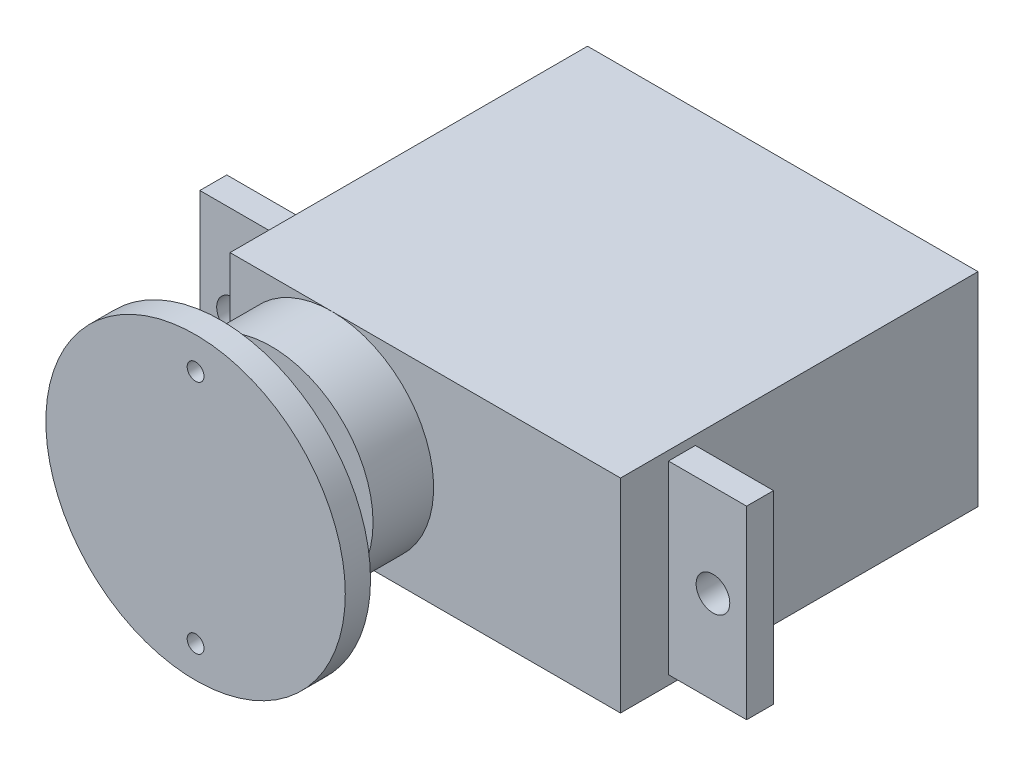
ISO-10303-21;
HEADER;
FILE_DESCRIPTION(('STEP AP214'),'2;1');
FILE_NAME('part.step','',(''),(''),'','','');
FILE_SCHEMA(('AUTOMOTIVE_DESIGN { 1 0 10303 214 1 1 1 1 }'));
ENDSEC;
DATA;
#1=APPLICATION_CONTEXT('core data for automotive mechanical design processes');
#2=APPLICATION_PROTOCOL_DEFINITION('international standard','automotive_design',2000,#1);
#3=PRODUCT_CONTEXT('',#1,'mechanical');
#4=PRODUCT('Part','Part','',(#3));
#5=PRODUCT_RELATED_PRODUCT_CATEGORY('part','',(#4));
#6=PRODUCT_DEFINITION_FORMATION('','',#4);
#7=PRODUCT_DEFINITION_CONTEXT('part definition',#1,'design');
#8=PRODUCT_DEFINITION('design','',#6,#7);
#9=PRODUCT_DEFINITION_SHAPE('','',#8);
#10=(LENGTH_UNIT() NAMED_UNIT(*) SI_UNIT(.MILLI.,.METRE.));
#11=(NAMED_UNIT(*) PLANE_ANGLE_UNIT() SI_UNIT($,.RADIAN.));
#12=(NAMED_UNIT(*) SI_UNIT($,.STERADIAN.) SOLID_ANGLE_UNIT());
#13=UNCERTAINTY_MEASURE_WITH_UNIT(LENGTH_MEASURE(1.E-05),#10,'distance_accuracy_value','');
#14=(GEOMETRIC_REPRESENTATION_CONTEXT(3) GLOBAL_UNCERTAINTY_ASSIGNED_CONTEXT((#13)) GLOBAL_UNIT_ASSIGNED_CONTEXT((#10,
#11,#12)) REPRESENTATION_CONTEXT('',''));
#15=CARTESIAN_POINT('',(0.,0.,0.));
#16=DIRECTION('',(0.,0.,1.));
#17=DIRECTION('',(1.,0.,0.));
#18=AXIS2_PLACEMENT_3D('',#15,#16,#17);
#19=CARTESIAN_POINT('',(23.21,0.,21.25));
#20=DIRECTION('',(-1.,0.,0.));
#21=DIRECTION('',(0.,0.,1.));
#22=AXIS2_PLACEMENT_3D('',#19,#20,#21);
#23=PLANE('',#22);
#24=DIRECTION('',(0.,1.,0.));
#25=VECTOR('',#24,1.);
#26=CARTESIAN_POINT('',(23.21,0.,0.));
#27=LINE('',#26,#25);
#28=CARTESIAN_POINT('',(23.21,0.,0.));
#29=VERTEX_POINT('',#28);
#30=CARTESIAN_POINT('',(23.21,12.1,0.));
#31=VERTEX_POINT('',#30);
#32=EDGE_CURVE('E271',#29,#31,#27,.T.);
#33=ORIENTED_EDGE('',*,*,#32,.T.);
#34=DIRECTION('',(0.,0.,-1.));
#35=VECTOR('',#34,1.);
#36=CARTESIAN_POINT('',(23.21,12.1,21.25));
#37=LINE('',#36,#35);
#38=CARTESIAN_POINT('',(23.21,12.1,21.25));
#39=VERTEX_POINT('',#38);
#40=EDGE_CURVE('E277',#39,#31,#37,.T.);
#41=ORIENTED_EDGE('',*,*,#40,.F.);
#42=DIRECTION('',(0.,1.,0.));
#43=VECTOR('',#42,1.);
#44=CARTESIAN_POINT('',(23.21,0.,21.25));
#45=LINE('',#44,#43);
#46=CARTESIAN_POINT('',(23.21,0.,21.25));
#47=VERTEX_POINT('',#46);
#48=EDGE_CURVE('E257',#47,#39,#45,.T.);
#49=ORIENTED_EDGE('',*,*,#48,.F.);
#50=DIRECTION('',(0.,0.,-1.));
#51=VECTOR('',#50,1.);
#52=CARTESIAN_POINT('',(23.21,0.,21.25));
#53=LINE('',#52,#51);
#54=EDGE_CURVE('E281',#47,#29,#53,.T.);
#55=ORIENTED_EDGE('',*,*,#54,.T.);
#56=EDGE_LOOP('',(#33,#41,#49,#55));
#57=FACE_BOUND('',#56,.T.);
#58=DIRECTION('',(0.,0.,-1.));
#59=VECTOR('',#58,1.);
#60=CARTESIAN_POINT('',(23.21,0.55,18.4));
#61=LINE('',#60,#59);
#62=CARTESIAN_POINT('',(23.21,0.55,18.4));
#63=VERTEX_POINT('',#62);
#64=CARTESIAN_POINT('',(23.21,0.55,16.8));
#65=VERTEX_POINT('',#64);
#66=EDGE_CURVE('E35',#63,#65,#61,.T.);
#67=ORIENTED_EDGE('',*,*,#66,.F.);
#68=DIRECTION('',(0.,-1.,0.));
#69=VECTOR('',#68,1.);
#70=CARTESIAN_POINT('',(23.21,11.55,18.4));
#71=LINE('',#70,#69);
#72=CARTESIAN_POINT('',(23.21,11.55,18.4));
#73=VERTEX_POINT('',#72);
#74=EDGE_CURVE('E39',#73,#63,#71,.T.);
#75=ORIENTED_EDGE('',*,*,#74,.F.);
#76=DIRECTION('',(0.,0.,1.));
#77=VECTOR('',#76,1.);
#78=CARTESIAN_POINT('',(23.21,11.55,16.8));
#79=LINE('',#78,#77);
#80=CARTESIAN_POINT('',(23.21,11.55,16.8));
#81=VERTEX_POINT('',#80);
#82=EDGE_CURVE('E147',#81,#73,#79,.T.);
#83=ORIENTED_EDGE('',*,*,#82,.F.);
#84=DIRECTION('',(0.,1.,0.));
#85=VECTOR('',#84,1.);
#86=CARTESIAN_POINT('',(23.21,0.55,16.8));
#87=LINE('',#86,#85);
#88=EDGE_CURVE('E157',#65,#81,#87,.T.);
#89=ORIENTED_EDGE('',*,*,#88,.F.);
#90=EDGE_LOOP('',(#67,#75,#83,#89));
#91=FACE_BOUND('',#90,.T.);
#92=ADVANCED_FACE('F17',(#57,#91),#23,.F.);
#93=CARTESIAN_POINT('',(0.,0.,21.25));
#94=DIRECTION('',(0.,0.,1.));
#95=DIRECTION('',(1.,0.,0.));
#96=AXIS2_PLACEMENT_3D('',#93,#94,#95);
#97=PLANE('',#96);
#98=CARTESIAN_POINT('',(6.05,6.05,21.25));
#99=DIRECTION('',(0.,0.,1.));
#100=DIRECTION('',(1.,0.,0.));
#101=AXIS2_PLACEMENT_3D('',#98,#99,#100);
#102=CIRCLE('',#101,6.05);
#103=CARTESIAN_POINT('',(6.05,12.1,21.25));
#104=VERTEX_POINT('',#103);
#105=CARTESIAN_POINT('',(0.,6.05,21.25));
#106=VERTEX_POINT('',#105);
#107=EDGE_CURVE('E191',#104,#106,#102,.T.);
#108=ORIENTED_EDGE('',*,*,#107,.F.);
#109=DIRECTION('',(-1.,0.,0.));
#110=VECTOR('',#109,1.);
#111=CARTESIAN_POINT('',(23.21,12.1,21.25));
#112=LINE('',#111,#110);
#113=CARTESIAN_POINT('',(0.,12.1,21.25));
#114=VERTEX_POINT('',#113);
#115=EDGE_CURVE('E260',#104,#114,#112,.T.);
#116=ORIENTED_EDGE('',*,*,#115,.T.);
#117=DIRECTION('',(0.,-1.,0.));
#118=VECTOR('',#117,1.);
#119=CARTESIAN_POINT('',(0.,12.1,21.25));
#120=LINE('',#119,#118);
#121=EDGE_CURVE('E247',#114,#106,#120,.T.);
#122=ORIENTED_EDGE('',*,*,#121,.T.);
#123=EDGE_LOOP('',(#108,#116,#122));
#124=FACE_BOUND('',#123,.T.);
#125=ADVANCED_FACE('F338',(#124),#97,.T.);
#126=CARTESIAN_POINT('',(6.05,0.,21.25));
#127=VERTEX_POINT('',#126);
#128=EDGE_CURVE('E27',#106,#127,#102,.T.);
#129=ORIENTED_EDGE('',*,*,#128,.F.);
#130=CARTESIAN_POINT('',(0.,0.,21.25));
#131=VERTEX_POINT('',#130);
#132=EDGE_CURVE('E252',#106,#131,#120,.T.);
#133=ORIENTED_EDGE('',*,*,#132,.T.);
#134=DIRECTION('',(1.,0.,0.));
#135=VECTOR('',#134,1.);
#136=CARTESIAN_POINT('',(0.,0.,21.25));
#137=LINE('',#136,#135);
#138=EDGE_CURVE('E253',#131,#127,#137,.T.);
#139=ORIENTED_EDGE('',*,*,#138,.T.);
#140=EDGE_LOOP('',(#129,#133,#139));
#141=FACE_BOUND('',#140,.T.);
#142=ADVANCED_FACE('F344',(#141),#97,.T.);
#143=CARTESIAN_POINT('',(0.,12.1,21.25));
#144=DIRECTION('',(1.,0.,0.));
#145=DIRECTION('',(0.,1.,0.));
#146=AXIS2_PLACEMENT_3D('',#143,#144,#145);
#147=PLANE('',#146);
#148=DIRECTION('',(0.,-1.,0.));
#149=VECTOR('',#148,1.);
#150=CARTESIAN_POINT('',(0.,11.55,18.4));
#151=LINE('',#150,#149);
#152=CARTESIAN_POINT('',(0.,11.55,18.4));
#153=VERTEX_POINT('',#152);
#154=CARTESIAN_POINT('',(0.,0.55,18.4));
#155=VERTEX_POINT('',#154);
#156=EDGE_CURVE('E207',#153,#155,#151,.T.);
#157=ORIENTED_EDGE('',*,*,#156,.T.);
#158=DIRECTION('',(0.,0.,-1.));
#159=VECTOR('',#158,1.);
#160=CARTESIAN_POINT('',(0.,0.55,18.4));
#161=LINE('',#160,#159);
#162=CARTESIAN_POINT('',(0.,0.55,16.8));
#163=VERTEX_POINT('',#162);
#164=EDGE_CURVE('E197',#155,#163,#161,.T.);
#165=ORIENTED_EDGE('',*,*,#164,.T.);
#166=DIRECTION('',(0.,1.,0.));
#167=VECTOR('',#166,1.);
#168=CARTESIAN_POINT('',(0.,0.55,16.8));
#169=LINE('',#168,#167);
#170=CARTESIAN_POINT('',(0.,11.55,16.8));
#171=VERTEX_POINT('',#170);
#172=EDGE_CURVE('E223',#163,#171,#169,.T.);
#173=ORIENTED_EDGE('',*,*,#172,.T.);
#174=DIRECTION('',(0.,0.,1.));
#175=VECTOR('',#174,1.);
#176=CARTESIAN_POINT('',(0.,11.55,16.8));
#177=LINE('',#176,#175);
#178=EDGE_CURVE('E227',#171,#153,#177,.T.);
#179=ORIENTED_EDGE('',*,*,#178,.T.);
#180=EDGE_LOOP('',(#157,#165,#173,#179));
#181=FACE_BOUND('',#180,.T.);
#182=DIRECTION('',(0.,-1.,0.));
#183=VECTOR('',#182,1.);
#184=CARTESIAN_POINT('',(0.,12.1,0.));
#185=LINE('',#184,#183);
#186=CARTESIAN_POINT('',(0.,12.1,0.));
#187=VERTEX_POINT('',#186);
#188=CARTESIAN_POINT('',(0.,0.,0.));
#189=VERTEX_POINT('',#188);
#190=EDGE_CURVE('E243',#187,#189,#185,.T.);
#191=ORIENTED_EDGE('',*,*,#190,.T.);
#192=DIRECTION('',(0.,0.,-1.));
#193=VECTOR('',#192,1.);
#194=CARTESIAN_POINT('',(0.,0.,21.25));
#195=LINE('',#194,#193);
#196=EDGE_CURVE('E285',#131,#189,#195,.T.);
#197=ORIENTED_EDGE('',*,*,#196,.F.);
#198=ORIENTED_EDGE('',*,*,#132,.F.);
#199=ORIENTED_EDGE('',*,*,#121,.F.);
#200=DIRECTION('',(0.,0.,-1.));
#201=VECTOR('',#200,1.);
#202=CARTESIAN_POINT('',(0.,12.1,21.25));
#203=LINE('',#202,#201);
#204=EDGE_CURVE('E264',#114,#187,#203,.T.);
#205=ORIENTED_EDGE('',*,*,#204,.T.);
#206=EDGE_LOOP('',(#191,#197,#198,#199,#205));
#207=FACE_BOUND('',#206,.T.);
#208=ADVANCED_FACE('F19',(#181,#207),#147,.F.);
#209=CARTESIAN_POINT('',(0.,0.,21.25));
#210=DIRECTION('',(0.,1.,0.));
#211=DIRECTION('',(0.,0.,1.));
#212=AXIS2_PLACEMENT_3D('',#209,#210,#211);
#213=PLANE('',#212);
#214=DIRECTION('',(1.,0.,0.));
#215=VECTOR('',#214,1.);
#216=CARTESIAN_POINT('',(0.,0.,0.));
#217=LINE('',#216,#215);
#218=EDGE_CURVE('E268',#189,#29,#217,.T.);
#219=ORIENTED_EDGE('',*,*,#218,.T.);
#220=ORIENTED_EDGE('',*,*,#54,.F.);
#221=EDGE_CURVE('E251',#127,#47,#137,.T.);
#222=ORIENTED_EDGE('',*,*,#221,.F.);
#223=ORIENTED_EDGE('',*,*,#138,.F.);
#224=ORIENTED_EDGE('',*,*,#196,.T.);
#225=EDGE_LOOP('',(#219,#220,#222,#223,#224));
#226=FACE_BOUND('',#225,.T.);
#227=ADVANCED_FACE('F351',(#226),#213,.F.);
#228=CARTESIAN_POINT('',(23.21,12.1,21.25));
#229=DIRECTION('',(0.,-1.,0.));
#230=DIRECTION('',(1.,0.,0.));
#231=AXIS2_PLACEMENT_3D('',#228,#229,#230);
#232=PLANE('',#231);
#233=DIRECTION('',(-1.,0.,0.));
#234=VECTOR('',#233,1.);
#235=CARTESIAN_POINT('',(23.21,12.1,0.));
#236=LINE('',#235,#234);
#237=EDGE_CURVE('E274',#31,#187,#236,.T.);
#238=ORIENTED_EDGE('',*,*,#237,.T.);
#239=ORIENTED_EDGE('',*,*,#204,.F.);
#240=ORIENTED_EDGE('',*,*,#115,.F.);
#241=EDGE_CURVE('E261',#39,#104,#112,.T.);
#242=ORIENTED_EDGE('',*,*,#241,.F.);
#243=ORIENTED_EDGE('',*,*,#40,.T.);
#244=EDGE_LOOP('',(#238,#239,#240,#242,#243));
#245=FACE_BOUND('',#244,.T.);
#246=ADVANCED_FACE('F349',(#245),#232,.F.);
#247=EDGE_CURVE('E201',#127,#104,#102,.T.);
#248=ORIENTED_EDGE('',*,*,#247,.F.);
#249=ORIENTED_EDGE('',*,*,#221,.T.);
#250=ORIENTED_EDGE('',*,*,#48,.T.);
#251=ORIENTED_EDGE('',*,*,#241,.T.);
#252=EDGE_LOOP('',(#248,#249,#250,#251));
#253=FACE_BOUND('',#252,.T.);
#254=ADVANCED_FACE('F347',(#253),#97,.T.);
#255=CARTESIAN_POINT('',(0.,0.,0.));
#256=DIRECTION('',(0.,0.,1.));
#257=DIRECTION('',(1.,0.,0.));
#258=AXIS2_PLACEMENT_3D('',#255,#256,#257);
#259=PLANE('',#258);
#260=ORIENTED_EDGE('',*,*,#190,.F.);
#261=ORIENTED_EDGE('',*,*,#237,.F.);
#262=ORIENTED_EDGE('',*,*,#32,.F.);
#263=ORIENTED_EDGE('',*,*,#218,.F.);
#264=EDGE_LOOP('',(#260,#261,#262,#263));
#265=FACE_BOUND('',#264,.T.);
#266=ADVANCED_FACE('F370',(#265),#259,.F.);
#267=CARTESIAN_POINT('',(-4.645,0.55,18.4));
#268=DIRECTION('',(0.,-1.,0.));
#269=DIRECTION('',(0.,0.,-1.));
#270=AXIS2_PLACEMENT_3D('',#267,#268,#269);
#271=PLANE('',#270);
#272=ORIENTED_EDGE('',*,*,#164,.F.);
#273=DIRECTION('',(1.,0.,0.));
#274=VECTOR('',#273,1.);
#275=CARTESIAN_POINT('',(-4.645,0.55,18.4));
#276=LINE('',#275,#274);
#277=CARTESIAN_POINT('',(-4.645,0.55,18.4));
#278=VERTEX_POINT('',#277);
#279=EDGE_CURVE('E219',#278,#155,#276,.T.);
#280=ORIENTED_EDGE('',*,*,#279,.F.);
#281=DIRECTION('',(0.,0.,-1.));
#282=VECTOR('',#281,1.);
#283=CARTESIAN_POINT('',(-4.645,0.55,18.4));
#284=LINE('',#283,#282);
#285=CARTESIAN_POINT('',(-4.645,0.55,16.8));
#286=VERTEX_POINT('',#285);
#287=EDGE_CURVE('E202',#278,#286,#284,.T.);
#288=ORIENTED_EDGE('',*,*,#287,.T.);
#289=DIRECTION('',(1.,0.,0.));
#290=VECTOR('',#289,1.);
#291=CARTESIAN_POINT('',(-4.645,0.55,16.8));
#292=LINE('',#291,#290);
#293=EDGE_CURVE('E240',#286,#163,#292,.T.);
#294=ORIENTED_EDGE('',*,*,#293,.T.);
#295=EDGE_LOOP('',(#272,#280,#288,#294));
#296=FACE_BOUND('',#295,.T.);
#297=ADVANCED_FACE('F489',(#296),#271,.T.);
#298=CARTESIAN_POINT('',(-4.645,0.55,16.8));
#299=DIRECTION('',(0.,0.,-1.));
#300=DIRECTION('',(0.,1.,0.));
#301=AXIS2_PLACEMENT_3D('',#298,#299,#300);
#302=PLANE('',#301);
#303=CARTESIAN_POINT('',(-2.645,6.05,16.8));
#304=DIRECTION('',(0.,0.,1.));
#305=DIRECTION('',(0.,-1.,0.));
#306=AXIS2_PLACEMENT_3D('',#303,#304,#305);
#307=CIRCLE('',#306,1.);
#308=CARTESIAN_POINT('',(-2.645,5.05,16.8));
#309=VERTEX_POINT('',#308);
#310=EDGE_CURVE('E173',#309,#309,#307,.T.);
#311=ORIENTED_EDGE('',*,*,#310,.T.);
#312=EDGE_LOOP('',(#311));
#313=FACE_BOUND('',#312,.T.);
#314=ORIENTED_EDGE('',*,*,#172,.F.);
#315=ORIENTED_EDGE('',*,*,#293,.F.);
#316=DIRECTION('',(0.,1.,0.));
#317=VECTOR('',#316,1.);
#318=CARTESIAN_POINT('',(-4.645,0.55,16.8));
#319=LINE('',#318,#317);
#320=CARTESIAN_POINT('',(-4.645,11.55,16.8));
#321=VERTEX_POINT('',#320);
#322=EDGE_CURVE('E206',#286,#321,#319,.T.);
#323=ORIENTED_EDGE('',*,*,#322,.T.);
#324=DIRECTION('',(1.,0.,0.));
#325=VECTOR('',#324,1.);
#326=CARTESIAN_POINT('',(-4.645,11.55,16.8));
#327=LINE('',#326,#325);
#328=EDGE_CURVE('E237',#321,#171,#327,.T.);
#329=ORIENTED_EDGE('',*,*,#328,.T.);
#330=EDGE_LOOP('',(#314,#315,#323,#329));
#331=FACE_BOUND('',#330,.T.);
#332=ADVANCED_FACE('F484',(#313,#331),#302,.T.);
#333=CARTESIAN_POINT('',(-4.645,11.55,16.8));
#334=DIRECTION('',(0.,1.,0.));
#335=DIRECTION('',(0.,0.,1.));
#336=AXIS2_PLACEMENT_3D('',#333,#334,#335);
#337=PLANE('',#336);
#338=ORIENTED_EDGE('',*,*,#178,.F.);
#339=ORIENTED_EDGE('',*,*,#328,.F.);
#340=DIRECTION('',(0.,0.,1.));
#341=VECTOR('',#340,1.);
#342=CARTESIAN_POINT('',(-4.645,11.55,16.8));
#343=LINE('',#342,#341);
#344=CARTESIAN_POINT('',(-4.645,11.55,18.4));
#345=VERTEX_POINT('',#344);
#346=EDGE_CURVE('E211',#321,#345,#343,.T.);
#347=ORIENTED_EDGE('',*,*,#346,.T.);
#348=DIRECTION('',(1.,0.,0.));
#349=VECTOR('',#348,1.);
#350=CARTESIAN_POINT('',(-4.645,11.55,18.4));
#351=LINE('',#350,#349);
#352=EDGE_CURVE('E234',#345,#153,#351,.T.);
#353=ORIENTED_EDGE('',*,*,#352,.T.);
#354=EDGE_LOOP('',(#338,#339,#347,#353));
#355=FACE_BOUND('',#354,.T.);
#356=ADVANCED_FACE('F478',(#355),#337,.T.);
#357=CARTESIAN_POINT('',(-4.645,11.55,18.4));
#358=DIRECTION('',(0.,0.,1.));
#359=DIRECTION('',(1.,0.,0.));
#360=AXIS2_PLACEMENT_3D('',#357,#358,#359);
#361=PLANE('',#360);
#362=CARTESIAN_POINT('',(-2.645,6.05,18.4));
#363=DIRECTION('',(0.,0.,1.));
#364=DIRECTION('',(0.,-1.,0.));
#365=AXIS2_PLACEMENT_3D('',#362,#363,#364);
#366=CIRCLE('',#365,1.);
#367=CARTESIAN_POINT('',(-2.645,5.05,18.4));
#368=VERTEX_POINT('',#367);
#369=EDGE_CURVE('E171',#368,#368,#366,.T.);
#370=ORIENTED_EDGE('',*,*,#369,.F.);
#371=EDGE_LOOP('',(#370));
#372=FACE_BOUND('',#371,.T.);
#373=ORIENTED_EDGE('',*,*,#156,.F.);
#374=ORIENTED_EDGE('',*,*,#352,.F.);
#375=DIRECTION('',(0.,-1.,0.));
#376=VECTOR('',#375,1.);
#377=CARTESIAN_POINT('',(-4.645,11.55,18.4));
#378=LINE('',#377,#376);
#379=EDGE_CURVE('E215',#345,#278,#378,.T.);
#380=ORIENTED_EDGE('',*,*,#379,.T.);
#381=ORIENTED_EDGE('',*,*,#279,.T.);
#382=EDGE_LOOP('',(#373,#374,#380,#381));
#383=FACE_BOUND('',#382,.T.);
#384=ADVANCED_FACE('F473',(#372,#383),#361,.T.);
#385=CARTESIAN_POINT('',(-4.645,0.,0.));
#386=DIRECTION('',(1.,0.,0.));
#387=DIRECTION('',(0.,1.,0.));
#388=AXIS2_PLACEMENT_3D('',#385,#386,#387);
#389=PLANE('',#388);
#390=ORIENTED_EDGE('',*,*,#287,.F.);
#391=ORIENTED_EDGE('',*,*,#379,.F.);
#392=ORIENTED_EDGE('',*,*,#346,.F.);
#393=ORIENTED_EDGE('',*,*,#322,.F.);
#394=EDGE_LOOP('',(#390,#391,#392,#393));
#395=FACE_BOUND('',#394,.T.);
#396=ADVANCED_FACE('F422',(#395),#389,.F.);
#397=CARTESIAN_POINT('',(6.05,6.05,24.85));
#398=DIRECTION('',(0.,0.,-1.));
#399=DIRECTION('',(-1.,0.,0.));
#400=AXIS2_PLACEMENT_3D('',#397,#398,#399);
#401=CYLINDRICAL_SURFACE('',#400,6.05);
#402=CARTESIAN_POINT('',(6.05,6.05,24.85));
#403=DIRECTION('',(0.,0.,1.));
#404=DIRECTION('',(1.,0.,0.));
#405=AXIS2_PLACEMENT_3D('',#402,#403,#404);
#406=CIRCLE('',#405,6.05);
#407=CARTESIAN_POINT('',(12.1,6.05,24.85));
#408=VERTEX_POINT('',#407);
#409=EDGE_CURVE('E193',#408,#408,#406,.T.);
#410=ORIENTED_EDGE('',*,*,#409,.F.);
#411=EDGE_LOOP('',(#410));
#412=FACE_BOUND('',#411,.T.);
#413=ORIENTED_EDGE('',*,*,#107,.T.);
#414=ORIENTED_EDGE('',*,*,#128,.T.);
#415=ORIENTED_EDGE('',*,*,#247,.T.);
#416=EDGE_LOOP('',(#413,#414,#415));
#417=FACE_BOUND('',#416,.T.);
#418=ADVANCED_FACE('F381',(#412,#417),#401,.T.);
#419=CARTESIAN_POINT('',(6.05,6.05,24.85));
#420=DIRECTION('',(0.,0.,1.));
#421=DIRECTION('',(1.,0.,0.));
#422=AXIS2_PLACEMENT_3D('',#419,#420,#421);
#423=PLANE('',#422);
#424=CARTESIAN_POINT('',(6.05,6.05,24.85));
#425=DIRECTION('',(0.,0.,1.));
#426=DIRECTION('',(1.,0.,0.));
#427=AXIS2_PLACEMENT_3D('',#424,#425,#426);
#428=CIRCLE('',#427,1.93335148818649);
#429=CARTESIAN_POINT('',(7.98335148818648,6.05,24.85));
#430=VERTEX_POINT('',#429);
#431=EDGE_CURVE('E11',#430,#430,#428,.T.);
#432=ORIENTED_EDGE('',*,*,#431,.F.);
#433=EDGE_LOOP('',(#432));
#434=FACE_BOUND('',#433,.T.);
#435=ORIENTED_EDGE('',*,*,#409,.T.);
#436=EDGE_LOOP('',(#435));
#437=FACE_BOUND('',#436,.T.);
#438=ADVANCED_FACE('F421',(#434,#437),#423,.T.);
#439=CARTESIAN_POINT('',(6.05,6.05,27.85));
#440=DIRECTION('',(0.,0.,-1.));
#441=DIRECTION('',(-1.,0.,0.));
#442=AXIS2_PLACEMENT_3D('',#439,#440,#441);
#443=CYLINDRICAL_SURFACE('',#442,1.93335148818649);
#444=CARTESIAN_POINT('',(6.05,6.05,27.85));
#445=DIRECTION('',(0.,0.,1.));
#446=DIRECTION('',(1.,0.,0.));
#447=AXIS2_PLACEMENT_3D('',#444,#445,#446);
#448=CIRCLE('',#447,1.93335148818649);
#449=CARTESIAN_POINT('',(7.98335148818648,6.05,27.85));
#450=VERTEX_POINT('',#449);
#451=EDGE_CURVE('E185',#450,#450,#448,.T.);
#452=ORIENTED_EDGE('',*,*,#451,.F.);
#453=EDGE_LOOP('',(#452));
#454=FACE_BOUND('',#453,.T.);
#455=ORIENTED_EDGE('',*,*,#431,.T.);
#456=EDGE_LOOP('',(#455));
#457=FACE_BOUND('',#456,.T.);
#458=ADVANCED_FACE('F443',(#454,#457),#443,.T.);
#459=CARTESIAN_POINT('',(6.05,6.05,29.35));
#460=DIRECTION('',(0.,0.,-1.));
#461=DIRECTION('',(-1.,0.,0.));
#462=AXIS2_PLACEMENT_3D('',#459,#460,#461);
#463=CYLINDRICAL_SURFACE('',#462,8.9);
#464=CARTESIAN_POINT('',(6.05,6.05,29.35));
#465=DIRECTION('',(0.,0.,1.));
#466=DIRECTION('',(1.,0.,0.));
#467=AXIS2_PLACEMENT_3D('',#464,#465,#466);
#468=CIRCLE('',#467,8.9);
#469=CARTESIAN_POINT('',(14.95,6.05,29.35));
#470=VERTEX_POINT('',#469);
#471=EDGE_CURVE('E181',#470,#470,#468,.T.);
#472=ORIENTED_EDGE('',*,*,#471,.F.);
#473=EDGE_LOOP('',(#472));
#474=FACE_BOUND('',#473,.T.);
#475=CARTESIAN_POINT('',(6.05,6.05,27.85));
#476=DIRECTION('',(0.,0.,1.));
#477=DIRECTION('',(1.,0.,0.));
#478=AXIS2_PLACEMENT_3D('',#475,#476,#477);
#479=CIRCLE('',#478,8.9);
#480=CARTESIAN_POINT('',(14.95,6.05,27.85));
#481=VERTEX_POINT('',#480);
#482=EDGE_CURVE('E177',#481,#481,#479,.T.);
#483=ORIENTED_EDGE('',*,*,#482,.T.);
#484=EDGE_LOOP('',(#483));
#485=FACE_BOUND('',#484,.T.);
#486=ADVANCED_FACE('F456',(#474,#485),#463,.T.);
#487=CARTESIAN_POINT('',(6.05,6.05,29.35));
#488=DIRECTION('',(0.,0.,1.));
#489=DIRECTION('',(1.,0.,0.));
#490=AXIS2_PLACEMENT_3D('',#487,#488,#489);
#491=PLANE('',#490);
#492=CARTESIAN_POINT('',(6.05,13.05,29.35));
#493=DIRECTION('',(0.,0.,1.));
#494=DIRECTION('',(1.,0.,0.));
#495=AXIS2_PLACEMENT_3D('',#492,#493,#494);
#496=CIRCLE('',#495,0.5);
#497=CARTESIAN_POINT('',(6.55,13.05,29.35));
#498=VERTEX_POINT('',#497);
#499=EDGE_CURVE('E294',#498,#498,#496,.T.);
#500=ORIENTED_EDGE('',*,*,#499,.F.);
#501=EDGE_LOOP('',(#500));
#502=FACE_BOUND('',#501,.T.);
#503=CARTESIAN_POINT('',(6.05,-0.950000000000015,29.35));
#504=DIRECTION('',(0.,0.,1.));
#505=DIRECTION('',(-1.,0.,0.));
#506=AXIS2_PLACEMENT_3D('',#503,#504,#505);
#507=CIRCLE('',#506,0.5);
#508=CARTESIAN_POINT('',(5.55,-0.950000000000015,29.35));
#509=VERTEX_POINT('',#508);
#510=EDGE_CURVE('E302',#509,#509,#507,.T.);
#511=ORIENTED_EDGE('',*,*,#510,.F.);
#512=EDGE_LOOP('',(#511));
#513=FACE_BOUND('',#512,.T.);
#514=ORIENTED_EDGE('',*,*,#471,.T.);
#515=EDGE_LOOP('',(#514));
#516=FACE_BOUND('',#515,.T.);
#517=ADVANCED_FACE('F464',(#502,#513,#516),#491,.T.);
#518=CARTESIAN_POINT('',(6.05,6.05,27.85));
#519=DIRECTION('',(0.,0.,1.));
#520=DIRECTION('',(1.,0.,0.));
#521=AXIS2_PLACEMENT_3D('',#518,#519,#520);
#522=PLANE('',#521);
#523=CARTESIAN_POINT('',(6.05,13.05,27.85));
#524=DIRECTION('',(0.,0.,1.));
#525=DIRECTION('',(1.,0.,0.));
#526=AXIS2_PLACEMENT_3D('',#523,#524,#525);
#527=CIRCLE('',#526,0.5);
#528=CARTESIAN_POINT('',(6.55,13.05,27.85));
#529=VERTEX_POINT('',#528);
#530=EDGE_CURVE('E21',#529,#529,#527,.T.);
#531=ORIENTED_EDGE('',*,*,#530,.T.);
#532=EDGE_LOOP('',(#531));
#533=FACE_BOUND('',#532,.T.);
#534=CARTESIAN_POINT('',(6.05,-0.950000000000015,27.85));
#535=DIRECTION('',(0.,0.,1.));
#536=DIRECTION('',(1.,0.,0.));
#537=AXIS2_PLACEMENT_3D('',#534,#535,#536);
#538=CIRCLE('',#537,0.5);
#539=CARTESIAN_POINT('',(6.55,-0.950000000000015,27.85));
#540=VERTEX_POINT('',#539);
#541=EDGE_CURVE('E291',#540,#540,#538,.T.);
#542=ORIENTED_EDGE('',*,*,#541,.T.);
#543=EDGE_LOOP('',(#542));
#544=FACE_BOUND('',#543,.T.);
#545=ORIENTED_EDGE('',*,*,#451,.T.);
#546=EDGE_LOOP('',(#545));
#547=FACE_BOUND('',#546,.T.);
#548=ORIENTED_EDGE('',*,*,#482,.F.);
#549=EDGE_LOOP('',(#548));
#550=FACE_BOUND('',#549,.T.);
#551=ADVANCED_FACE('F499',(#533,#544,#547,#550),#522,.F.);
#552=CARTESIAN_POINT('',(-2.645,6.05,16.8));
#553=DIRECTION('',(0.,0.,1.));
#554=DIRECTION('',(1.,0.,0.));
#555=AXIS2_PLACEMENT_3D('',#552,#553,#554);
#556=CYLINDRICAL_SURFACE('',#555,1.);
#557=ORIENTED_EDGE('',*,*,#310,.F.);
#558=EDGE_LOOP('',(#557));
#559=FACE_BOUND('',#558,.T.);
#560=ORIENTED_EDGE('',*,*,#369,.T.);
#561=EDGE_LOOP('',(#560));
#562=FACE_BOUND('',#561,.T.);
#563=ADVANCED_FACE('F495',(#559,#562),#556,.F.);
#564=CARTESIAN_POINT('',(27.855,0.55,18.4));
#565=DIRECTION('',(0.,1.,0.));
#566=DIRECTION('',(0.,0.,1.));
#567=AXIS2_PLACEMENT_3D('',#564,#565,#566);
#568=PLANE('',#567);
#569=ORIENTED_EDGE('',*,*,#66,.T.);
#570=DIRECTION('',(-1.,0.,0.));
#571=VECTOR('',#570,1.);
#572=CARTESIAN_POINT('',(27.855,0.55,16.8));
#573=LINE('',#572,#571);
#574=CARTESIAN_POINT('',(27.855,0.55,16.8));
#575=VERTEX_POINT('',#574);
#576=EDGE_CURVE('E138',#575,#65,#573,.T.);
#577=ORIENTED_EDGE('',*,*,#576,.F.);
#578=DIRECTION('',(0.,0.,-1.));
#579=VECTOR('',#578,1.);
#580=CARTESIAN_POINT('',(27.855,0.55,18.4));
#581=LINE('',#580,#579);
#582=CARTESIAN_POINT('',(27.855,0.55,18.4));
#583=VERTEX_POINT('',#582);
#584=EDGE_CURVE('E120',#583,#575,#581,.T.);
#585=ORIENTED_EDGE('',*,*,#584,.F.);
#586=DIRECTION('',(-1.,0.,0.));
#587=VECTOR('',#586,1.);
#588=CARTESIAN_POINT('',(27.855,0.55,18.4));
#589=LINE('',#588,#587);
#590=EDGE_CURVE('E128',#583,#63,#589,.T.);
#591=ORIENTED_EDGE('',*,*,#590,.T.);
#592=EDGE_LOOP('',(#569,#577,#585,#591));
#593=FACE_BOUND('',#592,.T.);
#594=ADVANCED_FACE('F136',(#593),#568,.F.);
#595=CARTESIAN_POINT('',(27.855,0.55,16.8));
#596=DIRECTION('',(0.,0.,1.));
#597=DIRECTION('',(0.,-1.,0.));
#598=AXIS2_PLACEMENT_3D('',#595,#596,#597);
#599=PLANE('',#598);
#600=CARTESIAN_POINT('',(25.855,6.05,16.8));
#601=DIRECTION('',(0.,0.,1.));
#602=DIRECTION('',(0.,-1.,0.));
#603=AXIS2_PLACEMENT_3D('',#600,#601,#602);
#604=CIRCLE('',#603,1.);
#605=CARTESIAN_POINT('',(25.855,5.05,16.8));
#606=VERTEX_POINT('',#605);
#607=EDGE_CURVE('E158',#606,#606,#604,.T.);
#608=ORIENTED_EDGE('',*,*,#607,.T.);
#609=EDGE_LOOP('',(#608));
#610=FACE_BOUND('',#609,.T.);
#611=ORIENTED_EDGE('',*,*,#88,.T.);
#612=DIRECTION('',(-1.,0.,0.));
#613=VECTOR('',#612,1.);
#614=CARTESIAN_POINT('',(27.855,11.55,16.8));
#615=LINE('',#614,#613);
#616=CARTESIAN_POINT('',(27.855,11.55,16.8));
#617=VERTEX_POINT('',#616);
#618=EDGE_CURVE('E166',#617,#81,#615,.T.);
#619=ORIENTED_EDGE('',*,*,#618,.F.);
#620=DIRECTION('',(0.,1.,0.));
#621=VECTOR('',#620,1.);
#622=CARTESIAN_POINT('',(27.855,0.55,16.8));
#623=LINE('',#622,#621);
#624=EDGE_CURVE('E140',#575,#617,#623,.T.);
#625=ORIENTED_EDGE('',*,*,#624,.F.);
#626=ORIENTED_EDGE('',*,*,#576,.T.);
#627=EDGE_LOOP('',(#611,#619,#625,#626));
#628=FACE_BOUND('',#627,.T.);
#629=ADVANCED_FACE('F334',(#610,#628),#599,.F.);
#630=CARTESIAN_POINT('',(27.855,11.55,16.8));
#631=DIRECTION('',(0.,-1.,0.));
#632=DIRECTION('',(0.,0.,-1.));
#633=AXIS2_PLACEMENT_3D('',#630,#631,#632);
#634=PLANE('',#633);
#635=ORIENTED_EDGE('',*,*,#82,.T.);
#636=DIRECTION('',(-1.,0.,0.));
#637=VECTOR('',#636,1.);
#638=CARTESIAN_POINT('',(27.855,11.55,18.4));
#639=LINE('',#638,#637);
#640=CARTESIAN_POINT('',(27.855,11.55,18.4));
#641=VERTEX_POINT('',#640);
#642=EDGE_CURVE('E134',#641,#73,#639,.T.);
#643=ORIENTED_EDGE('',*,*,#642,.F.);
#644=DIRECTION('',(0.,0.,1.));
#645=VECTOR('',#644,1.);
#646=CARTESIAN_POINT('',(27.855,11.55,16.8));
#647=LINE('',#646,#645);
#648=EDGE_CURVE('E123',#617,#641,#647,.T.);
#649=ORIENTED_EDGE('',*,*,#648,.F.);
#650=ORIENTED_EDGE('',*,*,#618,.T.);
#651=EDGE_LOOP('',(#635,#643,#649,#650));
#652=FACE_BOUND('',#651,.T.);
#653=ADVANCED_FACE('F326',(#652),#634,.F.);
#654=CARTESIAN_POINT('',(27.855,11.55,18.4));
#655=DIRECTION('',(0.,0.,-1.));
#656=DIRECTION('',(-1.,0.,0.));
#657=AXIS2_PLACEMENT_3D('',#654,#655,#656);
#658=PLANE('',#657);
#659=CARTESIAN_POINT('',(25.855,6.05,18.4));
#660=DIRECTION('',(0.,0.,1.));
#661=DIRECTION('',(0.,-1.,0.));
#662=AXIS2_PLACEMENT_3D('',#659,#660,#661);
#663=CIRCLE('',#662,1.);
#664=CARTESIAN_POINT('',(25.855,5.05,18.4));
#665=VERTEX_POINT('',#664);
#666=EDGE_CURVE('E150',#665,#665,#663,.T.);
#667=ORIENTED_EDGE('',*,*,#666,.F.);
#668=EDGE_LOOP('',(#667));
#669=FACE_BOUND('',#668,.T.);
#670=ORIENTED_EDGE('',*,*,#74,.T.);
#671=ORIENTED_EDGE('',*,*,#590,.F.);
#672=DIRECTION('',(0.,-1.,0.));
#673=VECTOR('',#672,1.);
#674=CARTESIAN_POINT('',(27.855,11.55,18.4));
#675=LINE('',#674,#673);
#676=EDGE_CURVE('E116',#641,#583,#675,.T.);
#677=ORIENTED_EDGE('',*,*,#676,.F.);
#678=ORIENTED_EDGE('',*,*,#642,.T.);
#679=EDGE_LOOP('',(#670,#671,#677,#678));
#680=FACE_BOUND('',#679,.T.);
#681=ADVANCED_FACE('F131',(#669,#680),#658,.F.);
#682=CARTESIAN_POINT('',(27.855,0.,0.));
#683=DIRECTION('',(1.,0.,0.));
#684=DIRECTION('',(0.,0.,-1.));
#685=AXIS2_PLACEMENT_3D('',#682,#683,#684);
#686=PLANE('',#685);
#687=ORIENTED_EDGE('',*,*,#584,.T.);
#688=ORIENTED_EDGE('',*,*,#624,.T.);
#689=ORIENTED_EDGE('',*,*,#648,.T.);
#690=ORIENTED_EDGE('',*,*,#676,.T.);
#691=EDGE_LOOP('',(#687,#688,#689,#690));
#692=FACE_BOUND('',#691,.T.);
#693=ADVANCED_FACE('F118',(#692),#686,.T.);
#694=CARTESIAN_POINT('',(25.855,6.05,16.8));
#695=DIRECTION('',(0.,0.,1.));
#696=DIRECTION('',(1.,0.,0.));
#697=AXIS2_PLACEMENT_3D('',#694,#695,#696);
#698=CYLINDRICAL_SURFACE('',#697,1.);
#699=ORIENTED_EDGE('',*,*,#607,.F.);
#700=EDGE_LOOP('',(#699));
#701=FACE_BOUND('',#700,.T.);
#702=ORIENTED_EDGE('',*,*,#666,.T.);
#703=EDGE_LOOP('',(#702));
#704=FACE_BOUND('',#703,.T.);
#705=ADVANCED_FACE('F323',(#701,#704),#698,.F.);
#706=CARTESIAN_POINT('',(6.05,-0.950000000000015,27.75));
#707=DIRECTION('',(0.,0.,1.));
#708=DIRECTION('',(1.,0.,0.));
#709=AXIS2_PLACEMENT_3D('',#706,#707,#708);
#710=CYLINDRICAL_SURFACE('',#709,0.5);
#711=ORIENTED_EDGE('',*,*,#510,.T.);
#712=EDGE_LOOP('',(#711));
#713=FACE_BOUND('',#712,.T.);
#714=ORIENTED_EDGE('',*,*,#541,.F.);
#715=EDGE_LOOP('',(#714));
#716=FACE_BOUND('',#715,.T.);
#717=ADVANCED_FACE('F571',(#713,#716),#710,.F.);
#718=CARTESIAN_POINT('',(6.05,13.05,27.75));
#719=DIRECTION('',(0.,0.,1.));
#720=DIRECTION('',(1.,0.,0.));
#721=AXIS2_PLACEMENT_3D('',#718,#719,#720);
#722=CYLINDRICAL_SURFACE('',#721,0.5);
#723=ORIENTED_EDGE('',*,*,#499,.T.);
#724=EDGE_LOOP('',(#723));
#725=FACE_BOUND('',#724,.T.);
#726=ORIENTED_EDGE('',*,*,#530,.F.);
#727=EDGE_LOOP('',(#726));
#728=FACE_BOUND('',#727,.T.);
#729=ADVANCED_FACE('F583',(#725,#728),#722,.F.);
#730=CLOSED_SHELL('',(#92,#125,#142,#208,#227,#246,#254,#266,#297,#332,#356,#384,#396,#418,#438,
#458,#486,#517,#551,#563,#594,#629,#653,#681,#693,#705,#717,#729));
#731=MANIFOLD_SOLID_BREP('B1',#730);
#732=ADVANCED_BREP_SHAPE_REPRESENTATION('',(#18,#731),#14);
#733=SHAPE_DEFINITION_REPRESENTATION(#9,#732);
ENDSEC;
END-ISO-10303-21;
